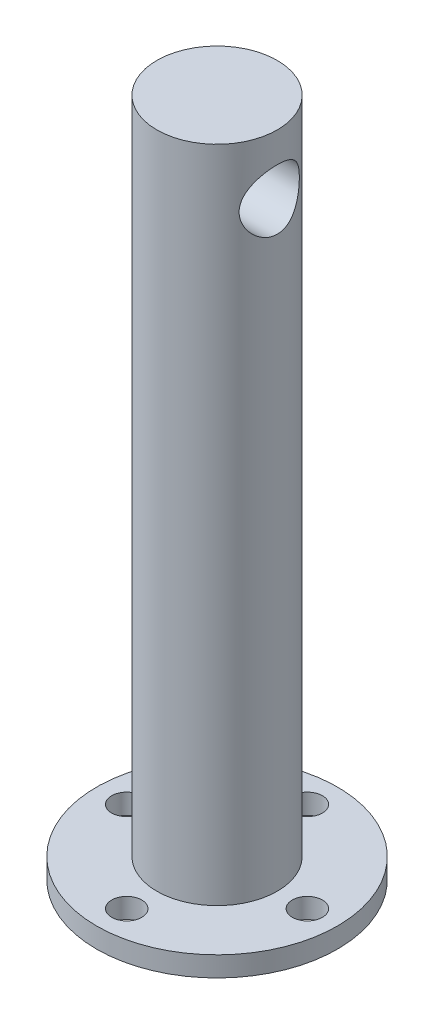
ISO-10303-21;
HEADER;
FILE_DESCRIPTION(('STEP AP214'),'2;1');
FILE_NAME('part.step','',(''),(''),'','','');
FILE_SCHEMA(('AUTOMOTIVE_DESIGN { 1 0 10303 214 1 1 1 1 }'));
ENDSEC;
DATA;
#1=APPLICATION_CONTEXT('core data for automotive mechanical design processes');
#2=APPLICATION_PROTOCOL_DEFINITION('international standard','automotive_design',2000,#1);
#3=PRODUCT_CONTEXT('',#1,'mechanical');
#4=PRODUCT('Part','Part','',(#3));
#5=PRODUCT_RELATED_PRODUCT_CATEGORY('part','',(#4));
#6=PRODUCT_DEFINITION_FORMATION('','',#4);
#7=PRODUCT_DEFINITION_CONTEXT('part definition',#1,'design');
#8=PRODUCT_DEFINITION('design','',#6,#7);
#9=PRODUCT_DEFINITION_SHAPE('','',#8);
#10=(LENGTH_UNIT() NAMED_UNIT(*) SI_UNIT(.MILLI.,.METRE.));
#11=(NAMED_UNIT(*) PLANE_ANGLE_UNIT() SI_UNIT($,.RADIAN.));
#12=(NAMED_UNIT(*) SI_UNIT($,.STERADIAN.) SOLID_ANGLE_UNIT());
#13=UNCERTAINTY_MEASURE_WITH_UNIT(LENGTH_MEASURE(1.E-05),#10,'distance_accuracy_value','');
#14=(GEOMETRIC_REPRESENTATION_CONTEXT(3) GLOBAL_UNCERTAINTY_ASSIGNED_CONTEXT((#13)) GLOBAL_UNIT_ASSIGNED_CONTEXT((#10,
#11,#12)) REPRESENTATION_CONTEXT('',''));
#15=CARTESIAN_POINT('',(0.,0.,0.));
#16=DIRECTION('',(0.,0.,1.));
#17=DIRECTION('',(1.,0.,0.));
#18=AXIS2_PLACEMENT_3D('',#15,#16,#17);
#19=CARTESIAN_POINT('',(0.,5.,0.));
#20=DIRECTION('',(0.,-1.,0.));
#21=DIRECTION('',(0.,0.,-1.));
#22=AXIS2_PLACEMENT_3D('',#19,#20,#21);
#23=CYLINDRICAL_SURFACE('',#22,30.);
#24=CARTESIAN_POINT('',(0.,5.,0.));
#25=DIRECTION('',(0.,1.,0.));
#26=DIRECTION('',(0.,0.,1.));
#27=AXIS2_PLACEMENT_3D('',#24,#25,#26);
#28=CIRCLE('',#27,30.);
#29=CARTESIAN_POINT('',(0.,5.,30.));
#30=VERTEX_POINT('',#29);
#31=EDGE_CURVE('E45',#30,#30,#28,.T.);
#32=ORIENTED_EDGE('',*,*,#31,.F.);
#33=EDGE_LOOP('',(#32));
#34=FACE_BOUND('',#33,.T.);
#35=CARTESIAN_POINT('',(0.,0.,0.));
#36=DIRECTION('',(0.,1.,0.));
#37=DIRECTION('',(0.,0.,1.));
#38=AXIS2_PLACEMENT_3D('',#35,#36,#37);
#39=CIRCLE('',#38,30.);
#40=CARTESIAN_POINT('',(0.,0.,30.));
#41=VERTEX_POINT('',#40);
#42=EDGE_CURVE('E49',#41,#41,#39,.T.);
#43=ORIENTED_EDGE('',*,*,#42,.T.);
#44=EDGE_LOOP('',(#43));
#45=FACE_BOUND('',#44,.T.);
#46=ADVANCED_FACE('F33',(#34,#45),#23,.T.);
#47=CARTESIAN_POINT('',(0.,5.,0.));
#48=DIRECTION('',(0.,1.,0.));
#49=DIRECTION('',(0.,0.,1.));
#50=AXIS2_PLACEMENT_3D('',#47,#48,#49);
#51=PLANE('',#50);
#52=CARTESIAN_POINT('',(0.,5.,0.));
#53=DIRECTION('',(0.,1.,0.));
#54=DIRECTION('',(0.,0.,1.));
#55=AXIS2_PLACEMENT_3D('',#52,#53,#54);
#56=CIRCLE('',#55,15.);
#57=CARTESIAN_POINT('',(0.,5.,15.));
#58=VERTEX_POINT('',#57);
#59=EDGE_CURVE('E97',#58,#58,#56,.T.);
#60=ORIENTED_EDGE('',*,*,#59,.F.);
#61=EDGE_LOOP('',(#60));
#62=FACE_BOUND('',#61,.T.);
#63=CARTESIAN_POINT('',(0.,5.,-22.5));
#64=DIRECTION('',(0.,1.,0.));
#65=DIRECTION('',(0.,0.,1.));
#66=AXIS2_PLACEMENT_3D('',#63,#64,#65);
#67=CIRCLE('',#66,3.75);
#68=CARTESIAN_POINT('',(0.,5.,-18.75));
#69=VERTEX_POINT('',#68);
#70=EDGE_CURVE('E89',#69,#69,#67,.T.);
#71=ORIENTED_EDGE('',*,*,#70,.F.);
#72=EDGE_LOOP('',(#71));
#73=FACE_BOUND('',#72,.T.);
#74=CARTESIAN_POINT('',(22.5000000000007,5.,-7.05797229413404E-13));
#75=DIRECTION('',(0.,1.,0.));
#76=DIRECTION('',(0.,0.,1.));
#77=AXIS2_PLACEMENT_3D('',#74,#75,#76);
#78=CIRCLE('',#77,3.75);
#79=CARTESIAN_POINT('',(22.5000000000007,5.,3.74999999999929));
#80=VERTEX_POINT('',#79);
#81=EDGE_CURVE('E102',#80,#80,#78,.T.);
#82=ORIENTED_EDGE('',*,*,#81,.F.);
#83=EDGE_LOOP('',(#82));
#84=FACE_BOUND('',#83,.T.);
#85=CARTESIAN_POINT('',(1.41159445882681E-12,5.,22.5));
#86=DIRECTION('',(0.,1.,0.));
#87=DIRECTION('',(0.,0.,1.));
#88=AXIS2_PLACEMENT_3D('',#85,#86,#87);
#89=CIRCLE('',#88,3.75);
#90=CARTESIAN_POINT('',(1.41159445882681E-12,5.,26.25));
#91=VERTEX_POINT('',#90);
#92=EDGE_CURVE('E108',#91,#91,#89,.T.);
#93=ORIENTED_EDGE('',*,*,#92,.F.);
#94=EDGE_LOOP('',(#93));
#95=FACE_BOUND('',#94,.T.);
#96=CARTESIAN_POINT('',(-22.4999999999993,5.,7.08552684711486E-13));
#97=DIRECTION('',(0.,1.,0.));
#98=DIRECTION('',(0.,0.,1.));
#99=AXIS2_PLACEMENT_3D('',#96,#97,#98);
#100=CIRCLE('',#99,3.75);
#101=CARTESIAN_POINT('',(-22.4999999999993,5.,3.75000000000071));
#102=VERTEX_POINT('',#101);
#103=EDGE_CURVE('E114',#102,#102,#100,.T.);
#104=ORIENTED_EDGE('',*,*,#103,.F.);
#105=EDGE_LOOP('',(#104));
#106=FACE_BOUND('',#105,.T.);
#107=ORIENTED_EDGE('',*,*,#31,.T.);
#108=EDGE_LOOP('',(#107));
#109=FACE_BOUND('',#108,.T.);
#110=ADVANCED_FACE('F74',(#62,#73,#84,#95,#106,#109),#51,.T.);
#111=CARTESIAN_POINT('',(0.,0.,0.));
#112=DIRECTION('',(0.,1.,0.));
#113=DIRECTION('',(0.,0.,1.));
#114=AXIS2_PLACEMENT_3D('',#111,#112,#113);
#115=PLANE('',#114);
#116=CARTESIAN_POINT('',(0.,0.,-22.5));
#117=DIRECTION('',(0.,1.,0.));
#118=DIRECTION('',(0.,0.,1.));
#119=AXIS2_PLACEMENT_3D('',#116,#117,#118);
#120=CIRCLE('',#119,3.75);
#121=CARTESIAN_POINT('',(0.,0.,-18.75));
#122=VERTEX_POINT('',#121);
#123=EDGE_CURVE('E87',#122,#122,#120,.T.);
#124=ORIENTED_EDGE('',*,*,#123,.T.);
#125=EDGE_LOOP('',(#124));
#126=FACE_BOUND('',#125,.T.);
#127=CARTESIAN_POINT('',(22.5000000000007,0.,-7.05797229413404E-13));
#128=DIRECTION('',(0.,1.,0.));
#129=DIRECTION('',(0.,0.,1.));
#130=AXIS2_PLACEMENT_3D('',#127,#128,#129);
#131=CIRCLE('',#130,3.75);
#132=CARTESIAN_POINT('',(22.5000000000007,0.,3.74999999999929));
#133=VERTEX_POINT('',#132);
#134=EDGE_CURVE('E94',#133,#133,#131,.T.);
#135=ORIENTED_EDGE('',*,*,#134,.T.);
#136=EDGE_LOOP('',(#135));
#137=FACE_BOUND('',#136,.T.);
#138=CARTESIAN_POINT('',(1.41159445882681E-12,0.,22.5));
#139=DIRECTION('',(0.,1.,0.));
#140=DIRECTION('',(0.,0.,1.));
#141=AXIS2_PLACEMENT_3D('',#138,#139,#140);
#142=CIRCLE('',#141,3.75);
#143=CARTESIAN_POINT('',(1.41159445882681E-12,0.,26.25));
#144=VERTEX_POINT('',#143);
#145=EDGE_CURVE('E105',#144,#144,#142,.T.);
#146=ORIENTED_EDGE('',*,*,#145,.T.);
#147=EDGE_LOOP('',(#146));
#148=FACE_BOUND('',#147,.T.);
#149=CARTESIAN_POINT('',(-22.4999999999993,0.,7.08552684711486E-13));
#150=DIRECTION('',(0.,1.,0.));
#151=DIRECTION('',(0.,0.,1.));
#152=AXIS2_PLACEMENT_3D('',#149,#150,#151);
#153=CIRCLE('',#152,3.75);
#154=CARTESIAN_POINT('',(-22.4999999999993,0.,3.75000000000071));
#155=VERTEX_POINT('',#154);
#156=EDGE_CURVE('E111',#155,#155,#153,.T.);
#157=ORIENTED_EDGE('',*,*,#156,.T.);
#158=EDGE_LOOP('',(#157));
#159=FACE_BOUND('',#158,.T.);
#160=ORIENTED_EDGE('',*,*,#42,.F.);
#161=EDGE_LOOP('',(#160));
#162=FACE_BOUND('',#161,.T.);
#163=ADVANCED_FACE('F79',(#126,#137,#148,#159,#162),#115,.F.);
#164=CARTESIAN_POINT('',(-22.4999999999993,0.,7.08552684711486E-13));
#165=DIRECTION('',(0.,1.,0.));
#166=DIRECTION('',(0.,0.,1.));
#167=AXIS2_PLACEMENT_3D('',#164,#165,#166);
#168=CYLINDRICAL_SURFACE('',#167,3.75);
#169=ORIENTED_EDGE('',*,*,#156,.F.);
#170=EDGE_LOOP('',(#169));
#171=FACE_BOUND('',#170,.T.);
#172=ORIENTED_EDGE('',*,*,#103,.T.);
#173=EDGE_LOOP('',(#172));
#174=FACE_BOUND('',#173,.T.);
#175=ADVANCED_FACE('F139',(#171,#174),#168,.F.);
#176=CARTESIAN_POINT('',(1.41159445882681E-12,0.,22.5));
#177=DIRECTION('',(0.,1.,0.));
#178=DIRECTION('',(0.,0.,1.));
#179=AXIS2_PLACEMENT_3D('',#176,#177,#178);
#180=CYLINDRICAL_SURFACE('',#179,3.75);
#181=ORIENTED_EDGE('',*,*,#145,.F.);
#182=EDGE_LOOP('',(#181));
#183=FACE_BOUND('',#182,.T.);
#184=ORIENTED_EDGE('',*,*,#92,.T.);
#185=EDGE_LOOP('',(#184));
#186=FACE_BOUND('',#185,.T.);
#187=ADVANCED_FACE('F136',(#183,#186),#180,.F.);
#188=CARTESIAN_POINT('',(22.5000000000007,0.,-7.05797229413404E-13));
#189=DIRECTION('',(0.,1.,0.));
#190=DIRECTION('',(0.,0.,1.));
#191=AXIS2_PLACEMENT_3D('',#188,#189,#190);
#192=CYLINDRICAL_SURFACE('',#191,3.75);
#193=ORIENTED_EDGE('',*,*,#134,.F.);
#194=EDGE_LOOP('',(#193));
#195=FACE_BOUND('',#194,.T.);
#196=ORIENTED_EDGE('',*,*,#81,.T.);
#197=EDGE_LOOP('',(#196));
#198=FACE_BOUND('',#197,.T.);
#199=ADVANCED_FACE('F138',(#195,#198),#192,.F.);
#200=CARTESIAN_POINT('',(0.,0.,-22.5));
#201=DIRECTION('',(0.,1.,0.));
#202=DIRECTION('',(0.,0.,1.));
#203=AXIS2_PLACEMENT_3D('',#200,#201,#202);
#204=CYLINDRICAL_SURFACE('',#203,3.75);
#205=ORIENTED_EDGE('',*,*,#123,.F.);
#206=EDGE_LOOP('',(#205));
#207=FACE_BOUND('',#206,.T.);
#208=ORIENTED_EDGE('',*,*,#70,.T.);
#209=EDGE_LOOP('',(#208));
#210=FACE_BOUND('',#209,.T.);
#211=ADVANCED_FACE('F70',(#207,#210),#204,.F.);
#212=CARTESIAN_POINT('',(0.,169.27,0.));
#213=DIRECTION('',(0.,-1.,0.));
#214=DIRECTION('',(0.,0.,-1.));
#215=AXIS2_PLACEMENT_3D('',#212,#213,#214);
#216=CYLINDRICAL_SURFACE('',#215,15.);
#217=CARTESIAN_POINT('',(-12.9903810567666,154.27,-7.50000000000001));
#218=CARTESIAN_POINT('',(-12.990382181035,154.46549729249,-7.49999915219102));
#219=CARTESIAN_POINT('',(-12.9948093228963,154.661011627906,-7.49234594296004));
#220=CARTESIAN_POINT('',(-13.0123535007346,155.050533562336,-7.46183346896063));
#221=CARTESIAN_POINT('',(-13.0254745822937,155.244540417328,-7.43896712498941));
#222=CARTESIAN_POINT('',(-13.0599426771176,155.62976755331,-7.37828654739348));
#223=CARTESIAN_POINT('',(-13.0813025892036,155.820982974345,-7.34044887204589));
#224=CARTESIAN_POINT('',(-13.1314907641568,156.199036478268,-7.2502832763033));
#225=CARTESIAN_POINT('',(-13.1603222743731,156.385872619209,-7.19794905465279));
#226=CARTESIAN_POINT('',(-13.2243001063235,156.752855385401,-7.07971539301251));
#227=CARTESIAN_POINT('',(-13.2594088156932,156.93303453594,-7.01389642712031));
#228=CARTESIAN_POINT('',(-13.3349831889209,157.286902622425,-6.86912607915748));
#229=CARTESIAN_POINT('',(-13.3754509246287,157.460589014738,-6.79016961496391));
#230=CARTESIAN_POINT('',(-13.5031657459223,157.970486436102,-6.53458165294547));
#231=CARTESIAN_POINT('',(-13.5967885797889,158.295882954901,-6.33911850533734));
#232=CARTESIAN_POINT('',(-13.7997722488749,158.937342944408,-5.88499039409601));
#233=CARTESIAN_POINT('',(-13.9097942423497,159.250423097701,-5.62244233404368));
#234=CARTESIAN_POINT('',(-14.1279092446598,159.830583343052,-5.04935146826096));
#235=CARTESIAN_POINT('',(-14.236001267344,160.09764048963,-4.73878486768895));
#236=CARTESIAN_POINT('',(-14.3922677411176,160.466843548214,-4.23049481242523));
#237=CARTESIAN_POINT('',(-14.4449049107873,160.587873751014,-4.04756743682244));
#238=CARTESIAN_POINT('',(-14.5452036331898,160.813945458527,-3.6708266106901));
#239=CARTESIAN_POINT('',(-14.5928673051336,160.918993781942,-3.47701785131805));
#240=CARTESIAN_POINT('',(-14.6818428286494,161.112064494047,-3.07976082483334));
#241=CARTESIAN_POINT('',(-14.723156225286,161.200091025601,-2.87631491831242));
#242=CARTESIAN_POINT('',(-14.7982086294623,161.358146484365,-2.46119546749129));
#243=CARTESIAN_POINT('',(-14.8319484414824,161.428177323225,-2.24952279985798));
#244=CARTESIAN_POINT('',(-14.8887046642508,161.545021761813,-1.83496193120693));
#245=CARTESIAN_POINT('',(-14.9123131648937,161.593132574216,-1.63251998867097));
#246=CARTESIAN_POINT('',(-14.9514227342515,161.672447952661,-1.2235749234957));
#247=CARTESIAN_POINT('',(-14.9669241554582,161.70365325375,-1.01707197783208));
#248=CARTESIAN_POINT('',(-14.9893635097996,161.748729877792,-0.60182559566497));
#249=CARTESIAN_POINT('',(-14.9963058068642,161.762610034139,-0.39308335569041));
#250=CARTESIAN_POINT('',(-15.0014351981526,161.772871465425,0.0249331184730571));
#251=CARTESIAN_POINT('',(-14.9996228280321,161.76925381097,0.234207319330798));
#252=CARTESIAN_POINT('',(-14.9878390819988,161.745654340771,0.633235066994355));
#253=CARTESIAN_POINT('',(-14.9785935489249,161.727128184241,0.82309833127989));
#254=CARTESIAN_POINT('',(-14.953081841927,161.675751472943,1.20046493644168));
#255=CARTESIAN_POINT('',(-14.9368132913303,161.642896068949,1.38796745628716));
#256=CARTESIAN_POINT('',(-14.8976520521443,161.563232333742,1.75920233284614));
#257=CARTESIAN_POINT('',(-14.8747616746105,161.51642887031,1.94293598100009));
#258=CARTESIAN_POINT('',(-14.8228789596523,161.409323082231,2.30560974309448));
#259=CARTESIAN_POINT('',(-14.793884249491,161.349015507993,2.48454796248766));
#260=CARTESIAN_POINT('',(-14.7300206386001,161.21457035844,2.83889506276331));
#261=CARTESIAN_POINT('',(-14.695078180897,161.14025817226,3.01422444013302));
#262=CARTESIAN_POINT('',(-14.6203739158272,160.978980820506,3.35792342376136));
#263=CARTESIAN_POINT('',(-14.5806104853759,160.892011391613,3.52629066033772));
#264=CARTESIAN_POINT('',(-14.4553576002534,160.613113964726,4.01963951499522));
#265=CARTESIAN_POINT('',(-14.3638660854075,160.403116291977,4.33307864865501));
#266=CARTESIAN_POINT('',(-14.1633050914297,159.918219994431,4.95139135165846));
#267=CARTESIAN_POINT('',(-14.0533915290052,159.639062870889,5.25265452762021));
#268=CARTESIAN_POINT('',(-13.8889325397243,159.186521602817,5.66743502568295));
#269=CARTESIAN_POINT('',(-13.8341410663629,159.029911888663,5.79959345558815));
#270=CARTESIAN_POINT('',(-13.7260650185139,158.706008915733,6.05093566976302));
#271=CARTESIAN_POINT('',(-13.6727806810234,158.538713990035,6.17011742175538));
#272=CARTESIAN_POINT('',(-13.5658760225877,158.183249601703,6.40190092423391));
#273=CARTESIAN_POINT('',(-13.5124515808189,157.994429339273,6.51359631862867));
#274=CARTESIAN_POINT('',(-13.4107672748936,157.606711756012,6.72046150393888));
#275=CARTESIAN_POINT('',(-13.3625050847668,157.407819033588,6.81563874962027));
#276=CARTESIAN_POINT('',(-13.2729104159533,157.00119782575,6.98851428950619));
#277=CARTESIAN_POINT('',(-13.2315738484945,156.793474645164,7.06622290622511));
#278=CARTESIAN_POINT('',(-13.1574724129662,156.3705671574,7.20326332887099));
#279=CARTESIAN_POINT('',(-13.1247063761921,156.155383872043,7.26259764057921));
#280=CARTESIAN_POINT('',(-13.0713934707128,155.736621451489,7.35808542088785));
#281=CARTESIAN_POINT('',(-13.0500843955534,155.533472964191,7.39570258614448));
#282=CARTESIAN_POINT('',(-13.01682404884,155.124005688246,7.4540881247648));
#283=CARTESIAN_POINT('',(-13.0048722484707,154.917687079427,7.4748574502663));
#284=CARTESIAN_POINT('',(-12.9908402257778,154.503826992518,7.49921791198355));
#285=CARTESIAN_POINT('',(-12.9887540396929,154.296286329158,7.50281942614749));
#286=CARTESIAN_POINT('',(-12.9945291406031,153.881767815154,7.49281311131348));
#287=CARTESIAN_POINT('',(-13.0023897561492,153.674789927466,7.4792064439367));
#288=CARTESIAN_POINT('',(-13.0263214416929,153.285872703759,7.43743545480094));
#289=CARTESIAN_POINT('',(-13.0413965730853,153.103678775959,7.41103301062552));
#290=CARTESIAN_POINT('',(-13.0786605468612,152.742368006347,7.34507135546586));
#291=CARTESIAN_POINT('',(-13.1008517418108,152.563252202823,7.30550779326211));
#292=CARTESIAN_POINT('',(-13.1516491814641,152.209281191916,7.21365869037156));
#293=CARTESIAN_POINT('',(-13.1802545915359,152.034425433487,7.16137480480643));
#294=CARTESIAN_POINT('',(-13.2430583471052,151.689822635645,7.04455822855379));
#295=CARTESIAN_POINT('',(-13.2772588746105,151.520077620044,6.98002075757782));
#296=CARTESIAN_POINT('',(-13.3520005151611,151.178902619695,6.83600462250948));
#297=CARTESIAN_POINT('',(-13.392760622743,151.007752983416,6.75597608169157));
#298=CARTESIAN_POINT('',(-13.4782889012486,150.672706031423,6.58369023646963));
#299=CARTESIAN_POINT('',(-13.523058416627,150.508811176154,6.49142882505741));
#300=CARTESIAN_POINT('',(-13.6154877679512,150.188951323985,6.29525608536944));
#301=CARTESIAN_POINT('',(-13.6631483224838,150.032988316454,6.19134185521639));
#302=CARTESIAN_POINT('',(-13.7602460013661,149.729622764243,5.97243402893728));
#303=CARTESIAN_POINT('',(-13.8096832417081,149.582220780125,5.85743970861166));
#304=CARTESIAN_POINT('',(-13.9155491573882,149.278481798954,5.60169452099006));
#305=CARTESIAN_POINT('',(-13.9720719689066,149.123369033682,5.45952512014945));
#306=CARTESIAN_POINT('',(-14.0844912504233,148.825562102426,5.16258673777422));
#307=CARTESIAN_POINT('',(-14.1403878851899,148.682864599352,5.00782116373767));
#308=CARTESIAN_POINT('',(-14.2501767276826,148.410556918262,4.68629256911223));
#309=CARTESIAN_POINT('',(-14.30406743469,148.28095641911,4.51952082941855));
#310=CARTESIAN_POINT('',(-14.4083960180679,148.035886970304,4.1749856248131));
#311=CARTESIAN_POINT('',(-14.4588353543454,147.920412029147,3.9972268686577));
#312=CARTESIAN_POINT('',(-14.5562721242768,147.701520430315,3.6266542658706));
#313=CARTESIAN_POINT('',(-14.6031397998663,147.598513694919,3.43356346802267));
#314=CARTESIAN_POINT('',(-14.6905221014912,147.40935315509,3.03801844269131));
#315=CARTESIAN_POINT('',(-14.7310397139005,147.323191423868,2.83556867500392));
#316=CARTESIAN_POINT('',(-14.8045326784762,147.168675730204,2.42275459239431));
#317=CARTESIAN_POINT('',(-14.8375115237449,147.100313518271,2.21239399580207));
#318=CARTESIAN_POINT('',(-14.8949267083421,146.98223569595,1.78536997679443));
#319=CARTESIAN_POINT('',(-14.9193640606296,146.932517874422,1.56870730506277));
#320=CARTESIAN_POINT('',(-14.9570987709583,146.856107852783,1.15110375492594));
#321=CARTESIAN_POINT('',(-14.9712127859299,146.827720999752,0.950545284981405));
#322=CARTESIAN_POINT('',(-14.9913670911193,146.787259975532,0.547388996951646));
#323=CARTESIAN_POINT('',(-14.9974078937421,146.775184769046,0.344791309117544));
#324=CARTESIAN_POINT('',(-15.0012472475445,146.767505129279,-0.060731955705729));
#325=CARTESIAN_POINT('',(-14.9990482543318,146.771895788872,-0.263657416994989));
#326=CARTESIAN_POINT('',(-14.9864747243643,146.797079252701,-0.668228678158458));
#327=CARTESIAN_POINT('',(-14.9761004126756,146.8178716054,-0.869874513106654));
#328=CARTESIAN_POINT('',(-14.9484141785526,146.873674700473,-1.25700134962121));
#329=CARTESIAN_POINT('',(-14.9316070193227,146.907653005863,-1.44266872616871));
#330=CARTESIAN_POINT('',(-14.8915068164159,146.989324121132,-1.81031162182534));
#331=CARTESIAN_POINT('',(-14.8682115601484,147.03702160975,-1.99228585873566));
#332=CARTESIAN_POINT('',(-14.8156777873291,147.145635781281,-2.3512971339364));
#333=CARTESIAN_POINT('',(-14.7864410121111,147.206548591415,-2.5283356015483));
#334=CARTESIAN_POINT('',(-14.7226536726119,147.341072443221,-2.8766001889709));
#335=CARTESIAN_POINT('',(-14.6881010412765,147.414688425843,-3.04782401602414));
#336=CARTESIAN_POINT('',(-14.6128573725765,147.577390209739,-3.39064537651025));
#337=CARTESIAN_POINT('',(-14.5719682662374,147.666999351346,-3.56195129753748));
#338=CARTESIAN_POINT('',(-14.4861257520595,147.85866901143,-3.89641126112141));
#339=CARTESIAN_POINT('',(-14.4411709600745,147.960733774537,-4.05956249787543));
#340=CARTESIAN_POINT('',(-14.3016508219336,148.284575106338,-4.53562791530355));
#341=CARTESIAN_POINT('',(-14.2023915191712,148.524078719429,-4.83532115334168));
#342=CARTESIAN_POINT('',(-13.9896182489816,149.071060895566,-5.42194343509693));
#343=CARTESIAN_POINT('',(-13.8756687454419,149.382932230767,-5.70463394069455));
#344=CARTESIAN_POINT('',(-13.7099949874917,149.88379323966,-6.0873218915051));
#345=CARTESIAN_POINT('',(-13.6556020697553,150.056414612277,-6.20807712903995));
#346=CARTESIAN_POINT('',(-13.5501034682427,150.412004760842,-6.43508648513725));
#347=CARTESIAN_POINT('',(-13.4989982423941,150.594974971591,-6.54133858592571));
#348=CARTESIAN_POINT('',(-13.4001340435359,150.976284053381,-6.74160896775215));
#349=CARTESIAN_POINT('',(-13.352534408331,151.174927319092,-6.83512717738289));
#350=CARTESIAN_POINT('',(-13.2643156538703,151.580895362198,-7.00478946882537));
#351=CARTESIAN_POINT('',(-13.2236929420577,151.788215602831,-7.08094249897426));
#352=CARTESIAN_POINT('',(-13.1511314354761,152.209608565162,-7.21481348107953));
#353=CARTESIAN_POINT('',(-13.1191703328352,152.423662324952,-7.27257885859355));
#354=CARTESIAN_POINT('',(-13.0652214956916,152.857139080776,-7.36906123355885));
#355=CARTESIAN_POINT('',(-13.0432267890063,153.076558209756,-7.40779154896141));
#356=CARTESIAN_POINT('',(-13.0147131582628,153.458496675159,-7.45773453230137));
#357=CARTESIAN_POINT('',(-13.0056107894155,153.620236245445,-7.47356894324815));
#358=CARTESIAN_POINT('',(-12.9934440689235,153.944646568874,-7.49470238224567));
#359=CARTESIAN_POINT('',(-12.9903801212092,154.107317383582,-7.50000070550228));
#360=CARTESIAN_POINT('',(-12.9903810567666,154.27,-7.50000000000001));
#361=B_SPLINE_CURVE_WITH_KNOTS('',3,(#217,#218,#219,#220,#221,#222,#223,#224,#225,#226,#227,
#228,#229,#230,#231,#232,#233,#234,#235,#236,#237,#238,#239,#240,#241,#242,#243,#244,#245,#246,
#247,#248,#249,#250,#251,#252,#253,#254,#255,#256,#257,#258,#259,#260,#261,#262,#263,#264,#265,
#266,#267,#268,#269,#270,#271,#272,#273,#274,#275,#276,#277,#278,#279,#280,#281,#282,#283,#284,
#285,#286,#287,#288,#289,#290,#291,#292,#293,#294,#295,#296,#297,#298,#299,#300,#301,#302,#303,
#304,#305,#306,#307,#308,#309,#310,#311,#312,#313,#314,#315,#316,#317,#318,#319,#320,#321,#322,
#323,#324,#325,#326,#327,#328,#329,#330,#331,#332,#333,#334,#335,#336,#337,#338,#339,#340,#341,
#342,#343,#344,#345,#346,#347,#348,#349,#350,#351,#352,#353,#354,#355,#356,#357,#358,#359,#360),
.UNSPECIFIED.,.T.,.F.,(4,2,2,2,2,2,2,2,2,2,2,2,2,2,2,2,2,2,2,2,2,2,2,2,2,2,2,2,2,2,2,2,2,2,2,2,
2,2,2,2,2,2,2,2,2,2,2,2,2,2,2,2,2,2,2,2,2,2,2,2,2,2,2,2,2,2,2,2,2,2,2,4),(0.,0.586323576834738,
1.17292018151063,1.76043892185672,2.34821344249714,2.93257740658586,3.51716795442697,
4.68524892593733,5.94967082883546,7.21472131642651,7.89069130478281,8.56637207543369,
9.24188818729897,9.91733251057597,10.5447278994445,11.1720960071843,11.7991441143986,
12.4261538560646,12.9984442136809,13.5709283931728,14.1432130129766,14.7157204902737,
15.2959050840961,15.876285554844,17.0363679012783,18.3061098092582,18.9419219109117,
19.5778334442978,20.2543578506447,20.930576137907,21.6063937795331,22.2821192164369,
22.9043293236521,23.5265042648717,24.1483030533765,24.7700598702128,25.3235688877656,
25.877261084045,26.4308812744283,26.9847178849066,27.5639783078045,28.143433703745,
28.7230337220619,29.3026716490211,29.9555467841243,30.6082458877317,31.2614238706273,
31.9143238334088,32.584858068982,33.2550760062919,33.924982764499,34.5948100496521,
35.2031527379992,35.8114568131385,36.4195796171099,37.0276856800811,37.595533030973,
38.163574268506,38.73144926462,39.2995456379106,39.8917147636492,40.4840862553716,
41.6682672089651,42.9702980901662,43.62240841601,44.2746093755581,44.9476734677058,
45.6203899398508,46.2913570079877,46.9618539608751,47.4497291246447,47.9376369229167),.UNSPECIFIED.);
#362=CARTESIAN_POINT('',(-12.9903810567666,154.27,-7.50000000000001));
#363=VERTEX_POINT('',#362);
#364=EDGE_CURVE('E36',#363,#363,#361,.T.);
#365=ORIENTED_EDGE('',*,*,#364,.T.);
#366=EDGE_LOOP('',(#365));
#367=FACE_BOUND('',#366,.T.);
#368=CARTESIAN_POINT('',(12.9903810567666,154.27,-7.50000000000001));
#369=CARTESIAN_POINT('',(12.990382181035,154.07450270751,-7.49999915219102));
#370=CARTESIAN_POINT('',(12.9948093228963,153.878988372094,-7.49234594296004));
#371=CARTESIAN_POINT('',(13.0123535007346,153.489466437664,-7.46183346896063));
#372=CARTESIAN_POINT('',(13.0254745822937,153.295459582672,-7.43896712498941));
#373=CARTESIAN_POINT('',(13.0599426771176,152.91023244669,-7.37828654739348));
#374=CARTESIAN_POINT('',(13.0813025892036,152.719017025655,-7.34044887204589));
#375=CARTESIAN_POINT('',(13.1314907641568,152.340963521732,-7.2502832763033));
#376=CARTESIAN_POINT('',(13.1603222743731,152.154127380791,-7.19794905465279));
#377=CARTESIAN_POINT('',(13.2243001063235,151.787144614599,-7.07971539301251));
#378=CARTESIAN_POINT('',(13.2594088156932,151.60696546406,-7.01389642712031));
#379=CARTESIAN_POINT('',(13.3349831889209,151.253097377575,-6.86912607915748));
#380=CARTESIAN_POINT('',(13.3754509246287,151.079410985262,-6.79016961496391));
#381=CARTESIAN_POINT('',(13.5031657459223,150.569513563898,-6.53458165294547));
#382=CARTESIAN_POINT('',(13.5967885797889,150.244117045099,-6.33911850533734));
#383=CARTESIAN_POINT('',(13.7997722488749,149.602657055592,-5.88499039409601));
#384=CARTESIAN_POINT('',(13.9097942423497,149.289576902299,-5.62244233404368));
#385=CARTESIAN_POINT('',(14.1279092446598,148.709416656948,-5.04935146826096));
#386=CARTESIAN_POINT('',(14.236001267344,148.44235951037,-4.73878486768895));
#387=CARTESIAN_POINT('',(14.3922677411176,148.073156451786,-4.23049481242523));
#388=CARTESIAN_POINT('',(14.4449049107873,147.952126248986,-4.04756743682244));
#389=CARTESIAN_POINT('',(14.5452036331898,147.726054541473,-3.6708266106901));
#390=CARTESIAN_POINT('',(14.5928673051336,147.621006218058,-3.47701785131805));
#391=CARTESIAN_POINT('',(14.6818428286494,147.427935505954,-3.07976082483334));
#392=CARTESIAN_POINT('',(14.723156225286,147.339908974399,-2.87631491831242));
#393=CARTESIAN_POINT('',(14.7982086294623,147.181853515635,-2.46119546749129));
#394=CARTESIAN_POINT('',(14.8319484414824,147.111822676775,-2.24952279985798));
#395=CARTESIAN_POINT('',(14.8887046642508,146.994978238187,-1.83496193120694));
#396=CARTESIAN_POINT('',(14.9123131648937,146.946867425784,-1.63251998867097));
#397=CARTESIAN_POINT('',(14.9514227342515,146.867552047339,-1.22357492349571));
#398=CARTESIAN_POINT('',(14.9669241554582,146.83634674625,-1.01707197783208));
#399=CARTESIAN_POINT('',(14.9893635097996,146.791270122208,-0.601825595664971));
#400=CARTESIAN_POINT('',(14.9963058068642,146.777389965861,-0.393083355690411));
#401=CARTESIAN_POINT('',(15.0014351981526,146.767128534575,0.0249331184730562));
#402=CARTESIAN_POINT('',(14.9996228280321,146.77074618903,0.234207319330797));
#403=CARTESIAN_POINT('',(14.9878390819988,146.794345659229,0.633235066994355));
#404=CARTESIAN_POINT('',(14.9785935489249,146.812871815759,0.82309833127989));
#405=CARTESIAN_POINT('',(14.953081841927,146.864248527057,1.20046493644168));
#406=CARTESIAN_POINT('',(14.9368132913303,146.897103931051,1.38796745628716));
#407=CARTESIAN_POINT('',(14.8976520521443,146.976767666258,1.75920233284615));
#408=CARTESIAN_POINT('',(14.8747616746105,147.023571129691,1.94293598100009));
#409=CARTESIAN_POINT('',(14.8228789596523,147.130676917769,2.30560974309448));
#410=CARTESIAN_POINT('',(14.793884249491,147.190984492007,2.48454796248766));
#411=CARTESIAN_POINT('',(14.7300206386001,147.32542964156,2.83889506276331));
#412=CARTESIAN_POINT('',(14.695078180897,147.39974182774,3.01422444013301));
#413=CARTESIAN_POINT('',(14.6203739158272,147.561019179494,3.35792342376135));
#414=CARTESIAN_POINT('',(14.5806104853759,147.647988608387,3.52629066033772));
#415=CARTESIAN_POINT('',(14.4553576002534,147.926886035274,4.01963951499522));
#416=CARTESIAN_POINT('',(14.3638660854075,148.136883708024,4.33307864865502));
#417=CARTESIAN_POINT('',(14.1633050914297,148.621780005569,4.95139135165846));
#418=CARTESIAN_POINT('',(14.0533915290052,148.900937129111,5.25265452762021));
#419=CARTESIAN_POINT('',(13.8889325397244,149.353478397183,5.66743502568295));
#420=CARTESIAN_POINT('',(13.8341410663629,149.510088111337,5.79959345558813));
#421=CARTESIAN_POINT('',(13.7260650185139,149.833991084267,6.05093566976301));
#422=CARTESIAN_POINT('',(13.6727806810234,150.001286009965,6.17011742175537));
#423=CARTESIAN_POINT('',(13.5658760225877,150.356750398297,6.40190092423389));
#424=CARTESIAN_POINT('',(13.5124515808189,150.545570660727,6.51359631862865));
#425=CARTESIAN_POINT('',(13.4107672748936,150.933288243988,6.72046150393886));
#426=CARTESIAN_POINT('',(13.3625050847668,151.132180966412,6.81563874962025));
#427=CARTESIAN_POINT('',(13.2729104159533,151.53880217425,6.98851428950619));
#428=CARTESIAN_POINT('',(13.2315738484945,151.746525354836,7.0662229062251));
#429=CARTESIAN_POINT('',(13.1574724129662,152.1694328426,7.203263328871));
#430=CARTESIAN_POINT('',(13.1247063761921,152.384616127957,7.26259764057921));
#431=CARTESIAN_POINT('',(13.0713934707128,152.803378548511,7.35808542088785));
#432=CARTESIAN_POINT('',(13.0500843955534,153.006527035809,7.39570258614448));
#433=CARTESIAN_POINT('',(13.01682404884,153.415994311754,7.45408812476479));
#434=CARTESIAN_POINT('',(13.0048722484707,153.622312920573,7.4748574502663));
#435=CARTESIAN_POINT('',(12.9908402257778,154.036173007482,7.49921791198355));
#436=CARTESIAN_POINT('',(12.9887540396929,154.243713670842,7.50281942614749));
#437=CARTESIAN_POINT('',(12.9945291406031,154.658232184846,7.49281311131348));
#438=CARTESIAN_POINT('',(13.0023897561492,154.865210072534,7.4792064439367));
#439=CARTESIAN_POINT('',(13.0263214416929,155.254127296242,7.43743545480093));
#440=CARTESIAN_POINT('',(13.0413965730853,155.436321224041,7.41103301062551));
#441=CARTESIAN_POINT('',(13.0786605468612,155.797631993653,7.34507135546585));
#442=CARTESIAN_POINT('',(13.1008517418108,155.976747797177,7.3055077932621));
#443=CARTESIAN_POINT('',(13.1516491814642,156.330718808084,7.21365869037156));
#444=CARTESIAN_POINT('',(13.1802545915359,156.505574566513,7.16137480480642));
#445=CARTESIAN_POINT('',(13.2430583471052,156.850177364355,7.04455822855379));
#446=CARTESIAN_POINT('',(13.2772588746105,157.019922379956,6.98002075757782));
#447=CARTESIAN_POINT('',(13.3520005151611,157.361097380305,6.83600462250948));
#448=CARTESIAN_POINT('',(13.392760622743,157.532247016584,6.75597608169157));
#449=CARTESIAN_POINT('',(13.4782889012486,157.867293968577,6.58369023646963));
#450=CARTESIAN_POINT('',(13.523058416627,158.031188823846,6.49142882505741));
#451=CARTESIAN_POINT('',(13.6154877679512,158.351048676015,6.29525608536944));
#452=CARTESIAN_POINT('',(13.6631483224838,158.507011683546,6.19134185521639));
#453=CARTESIAN_POINT('',(13.7602460013661,158.810377235757,5.97243402893728));
#454=CARTESIAN_POINT('',(13.8096832417081,158.957779219875,5.85743970861166));
#455=CARTESIAN_POINT('',(13.9155491573882,159.261518201046,5.60169452099006));
#456=CARTESIAN_POINT('',(13.9720719689066,159.416630966318,5.45952512014945));
#457=CARTESIAN_POINT('',(14.0844912504233,159.714437897574,5.16258673777422));
#458=CARTESIAN_POINT('',(14.1403878851899,159.857135400648,5.00782116373766));
#459=CARTESIAN_POINT('',(14.2501767276826,160.129443081738,4.68629256911223));
#460=CARTESIAN_POINT('',(14.30406743469,160.25904358089,4.51952082941854));
#461=CARTESIAN_POINT('',(14.4083960180679,160.504113029696,4.17498562481309));
#462=CARTESIAN_POINT('',(14.4588353543454,160.619587970853,3.99722686865769));
#463=CARTESIAN_POINT('',(14.5562721242768,160.838479569685,3.62665426587059));
#464=CARTESIAN_POINT('',(14.6031397998663,160.941486305081,3.43356346802266));
#465=CARTESIAN_POINT('',(14.6905221014912,161.13064684491,3.03801844269129));
#466=CARTESIAN_POINT('',(14.7310397139005,161.216808576132,2.83556867500391));
#467=CARTESIAN_POINT('',(14.8045326784762,161.371324269796,2.4227545923943));
#468=CARTESIAN_POINT('',(14.8375115237449,161.439686481729,2.21239399580206));
#469=CARTESIAN_POINT('',(14.8949267083421,161.55776430405,1.78536997679442));
#470=CARTESIAN_POINT('',(14.9193640606296,161.607482125578,1.56870730506276));
#471=CARTESIAN_POINT('',(14.9570987709583,161.683892147217,1.15110375492593));
#472=CARTESIAN_POINT('',(14.9712127859299,161.712279000248,0.950545284981395));
#473=CARTESIAN_POINT('',(14.9913670911193,161.752740024468,0.547388996951637));
#474=CARTESIAN_POINT('',(14.9974078937421,161.764815230954,0.344791309117536));
#475=CARTESIAN_POINT('',(15.0012472475445,161.772494870721,-0.0607319557057389));
#476=CARTESIAN_POINT('',(14.9990482543318,161.768104211128,-0.263657416995));
#477=CARTESIAN_POINT('',(14.9864747243643,161.742920747299,-0.668228678158471));
#478=CARTESIAN_POINT('',(14.9761004126756,161.7221283946,-0.869874513106667));
#479=CARTESIAN_POINT('',(14.9484141785526,161.666325299527,-1.25700134962122));
#480=CARTESIAN_POINT('',(14.9316070193227,161.632346994137,-1.44266872616873));
#481=CARTESIAN_POINT('',(14.8915068164159,161.550675878868,-1.81031162182535));
#482=CARTESIAN_POINT('',(14.8682115601484,161.50297839025,-1.99228585873567));
#483=CARTESIAN_POINT('',(14.8156777873291,161.394364218719,-2.35129713393642));
#484=CARTESIAN_POINT('',(14.7864410121111,161.333451408585,-2.52833560154831));
#485=CARTESIAN_POINT('',(14.7226536726119,161.198927556779,-2.87660018897091));
#486=CARTESIAN_POINT('',(14.6881010412765,161.125311574157,-3.04782401602415));
#487=CARTESIAN_POINT('',(14.6128573725765,160.962609790261,-3.39064537651027));
#488=CARTESIAN_POINT('',(14.5719682662374,160.873000648654,-3.5619512975375));
#489=CARTESIAN_POINT('',(14.4861257520595,160.68133098857,-3.89641126112143));
#490=CARTESIAN_POINT('',(14.4411709600745,160.579266225463,-4.05956249787545));
#491=CARTESIAN_POINT('',(14.3016508219336,160.255424893662,-4.53562791530357));
#492=CARTESIAN_POINT('',(14.2023915191711,160.015921280571,-4.8353211533417));
#493=CARTESIAN_POINT('',(13.9896182489816,159.468939104434,-5.42194343509695));
#494=CARTESIAN_POINT('',(13.8756687454419,159.157067769233,-5.70463394069455));
#495=CARTESIAN_POINT('',(13.7099949874917,158.65620676034,-6.08732189150509));
#496=CARTESIAN_POINT('',(13.6556020697553,158.483585387723,-6.20807712903994));
#497=CARTESIAN_POINT('',(13.5501034682427,158.127995239158,-6.43508648513724));
#498=CARTESIAN_POINT('',(13.4989982423941,157.945025028409,-6.54133858592571));
#499=CARTESIAN_POINT('',(13.4001340435359,157.563715946619,-6.74160896775215));
#500=CARTESIAN_POINT('',(13.352534408331,157.365072680908,-6.83512717738289));
#501=CARTESIAN_POINT('',(13.2643156538703,156.959104637802,-7.00478946882537));
#502=CARTESIAN_POINT('',(13.2236929420577,156.751784397169,-7.08094249897426));
#503=CARTESIAN_POINT('',(13.1511314354761,156.330391434838,-7.21481348107953));
#504=CARTESIAN_POINT('',(13.1191703328352,156.116337675048,-7.27257885859356));
#505=CARTESIAN_POINT('',(13.0652214956916,155.682860919224,-7.36906123355885));
#506=CARTESIAN_POINT('',(13.0432267890063,155.463441790244,-7.40779154896142));
#507=CARTESIAN_POINT('',(13.0147131582628,155.081503324841,-7.45773453230137));
#508=CARTESIAN_POINT('',(13.0056107894155,154.919763754555,-7.47356894324815));
#509=CARTESIAN_POINT('',(12.9934440689235,154.595353431126,-7.49470238224567));
#510=CARTESIAN_POINT('',(12.9903801212092,154.432682616418,-7.50000070550228));
#511=CARTESIAN_POINT('',(12.9903810567666,154.27,-7.50000000000001));
#512=B_SPLINE_CURVE_WITH_KNOTS('',3,(#368,#369,#370,#371,#372,#373,#374,#375,#376,#377,#378,
#379,#380,#381,#382,#383,#384,#385,#386,#387,#388,#389,#390,#391,#392,#393,#394,#395,#396,#397,
#398,#399,#400,#401,#402,#403,#404,#405,#406,#407,#408,#409,#410,#411,#412,#413,#414,#415,#416,
#417,#418,#419,#420,#421,#422,#423,#424,#425,#426,#427,#428,#429,#430,#431,#432,#433,#434,#435,
#436,#437,#438,#439,#440,#441,#442,#443,#444,#445,#446,#447,#448,#449,#450,#451,#452,#453,#454,
#455,#456,#457,#458,#459,#460,#461,#462,#463,#464,#465,#466,#467,#468,#469,#470,#471,#472,#473,
#474,#475,#476,#477,#478,#479,#480,#481,#482,#483,#484,#485,#486,#487,#488,#489,#490,#491,#492,
#493,#494,#495,#496,#497,#498,#499,#500,#501,#502,#503,#504,#505,#506,#507,#508,#509,#510,#511),
.UNSPECIFIED.,.T.,.F.,(4,2,2,2,2,2,2,2,2,2,2,2,2,2,2,2,2,2,2,2,2,2,2,2,2,2,2,2,2,2,2,2,2,2,2,2,
2,2,2,2,2,2,2,2,2,2,2,2,2,2,2,2,2,2,2,2,2,2,2,2,2,2,2,2,2,2,2,2,2,2,2,4),(0.,0.586323576834738,
1.17292018151063,1.76043892185672,2.34821344249714,2.93257740658586,3.51716795442697,
4.68524892593733,5.94967082883546,7.21472131642651,7.89069130478281,8.56637207543369,
9.24188818729897,9.91733251057597,10.5447278994445,11.1720960071843,11.7991441143986,
12.4261538560646,12.9984442136809,13.5709283931728,14.1432130129766,14.7157204902737,
15.2959050840961,15.876285554844,17.0363679012784,18.3061098092582,18.9419219109116,
19.5778334442978,20.2543578506447,20.930576137907,21.6063937795331,22.2821192164369,
22.904329323652,23.5265042648717,24.1483030533765,24.7700598702128,25.3235688877657,
25.8772610840451,26.4308812744283,26.9847178849066,27.5639783078045,28.143433703745,
28.7230337220619,29.3026716490211,29.9555467841243,30.6082458877317,31.2614238706273,
31.9143238334087,32.584858068982,33.2550760062919,33.9249827644989,34.5948100496521,
35.2031527379992,35.8114568131385,36.4195796171099,37.0276856800811,37.5955330309729,
38.163574268506,38.73144926462,39.2995456379106,39.8917147636492,40.4840862553716,
41.6682672089651,42.9702980901662,43.62240841601,44.2746093755581,44.9476734677058,
45.6203899398508,46.2913570079877,46.9618539608751,47.4497291246447,47.9376369229166),.UNSPECIFIED.);
#513=CARTESIAN_POINT('',(12.9903810567666,154.27,-7.50000000000001));
#514=VERTEX_POINT('',#513);
#515=EDGE_CURVE('E10',#514,#514,#512,.T.);
#516=ORIENTED_EDGE('',*,*,#515,.T.);
#517=EDGE_LOOP('',(#516));
#518=FACE_BOUND('',#517,.T.);
#519=CARTESIAN_POINT('',(0.,169.27,0.));
#520=DIRECTION('',(0.,1.,0.));
#521=DIRECTION('',(0.,0.,1.));
#522=AXIS2_PLACEMENT_3D('',#519,#520,#521);
#523=CIRCLE('',#522,15.);
#524=CARTESIAN_POINT('',(0.,169.27,15.));
#525=VERTEX_POINT('',#524);
#526=EDGE_CURVE('E116',#525,#525,#523,.T.);
#527=ORIENTED_EDGE('',*,*,#526,.F.);
#528=EDGE_LOOP('',(#527));
#529=FACE_BOUND('',#528,.T.);
#530=ORIENTED_EDGE('',*,*,#59,.T.);
#531=EDGE_LOOP('',(#530));
#532=FACE_BOUND('',#531,.T.);
#533=ADVANCED_FACE('F55',(#367,#518,#529,#532),#216,.T.);
#534=CARTESIAN_POINT('',(0.,169.27,0.));
#535=DIRECTION('',(0.,1.,0.));
#536=DIRECTION('',(0.,0.,1.));
#537=AXIS2_PLACEMENT_3D('',#534,#535,#536);
#538=PLANE('',#537);
#539=ORIENTED_EDGE('',*,*,#526,.T.);
#540=EDGE_LOOP('',(#539));
#541=FACE_BOUND('',#540,.T.);
#542=ADVANCED_FACE('F62',(#541),#538,.T.);
#543=CARTESIAN_POINT('',(-30.,154.27,0.));
#544=DIRECTION('',(1.,0.,0.));
#545=DIRECTION('',(0.,0.,-1.));
#546=AXIS2_PLACEMENT_3D('',#543,#544,#545);
#547=CYLINDRICAL_SURFACE('',#546,7.50000000000001);
#548=ORIENTED_EDGE('',*,*,#515,.F.);
#549=EDGE_LOOP('',(#548));
#550=FACE_BOUND('',#549,.T.);
#551=ORIENTED_EDGE('',*,*,#364,.F.);
#552=EDGE_LOOP('',(#551));
#553=FACE_BOUND('',#552,.T.);
#554=ADVANCED_FACE('F59',(#550,#553),#547,.F.);
#555=CLOSED_SHELL('',(#46,#110,#163,#175,#187,#199,#211,#533,#542,#554));
#556=MANIFOLD_SOLID_BREP('B2',#555);
#557=ADVANCED_BREP_SHAPE_REPRESENTATION('',(#18,#556),#14);
#558=SHAPE_DEFINITION_REPRESENTATION(#9,#557);
ENDSEC;
END-ISO-10303-21;
